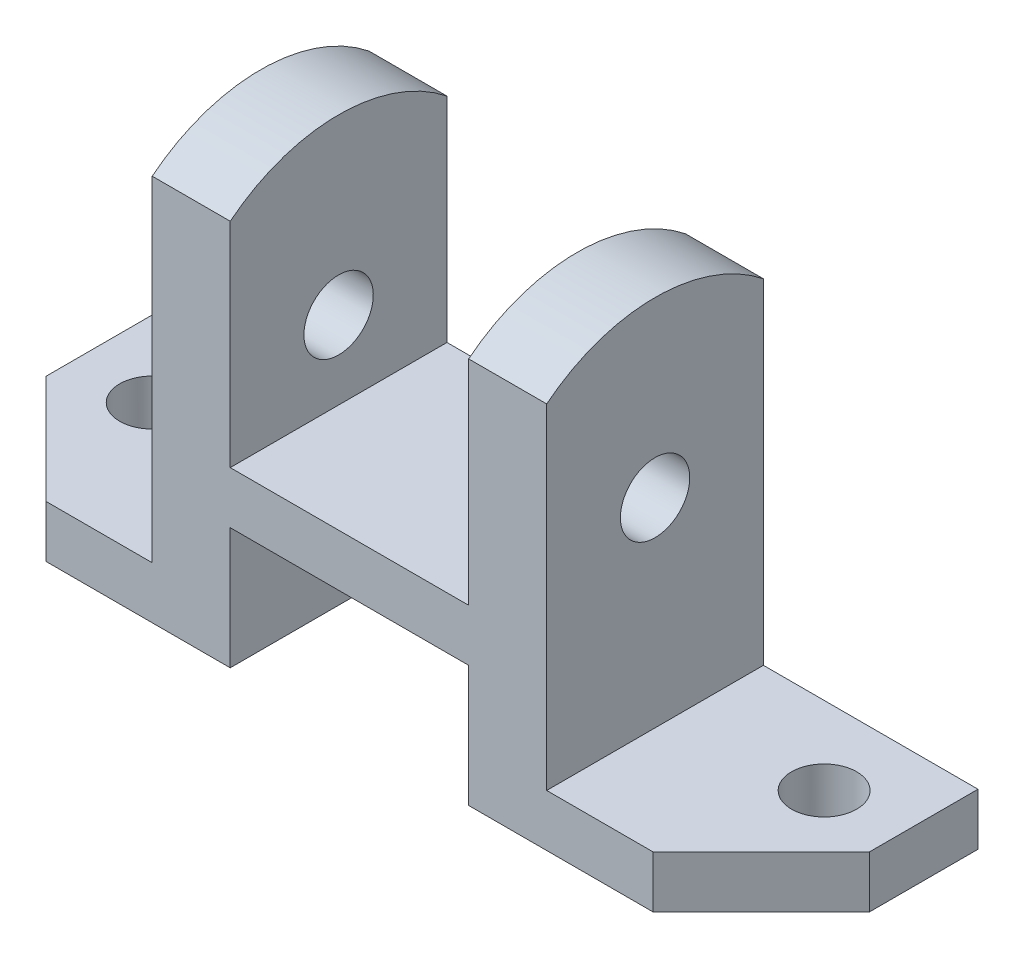
ISO-10303-21;
HEADER;
FILE_DESCRIPTION(('STEP AP214'),'2;1');
FILE_NAME('part.step','',(''),(''),'','','');
FILE_SCHEMA(('AUTOMOTIVE_DESIGN { 1 0 10303 214 1 1 1 1 }'));
ENDSEC;
DATA;
#1=APPLICATION_CONTEXT('core data for automotive mechanical design processes');
#2=APPLICATION_PROTOCOL_DEFINITION('international standard','automotive_design',2000,#1);
#3=PRODUCT_CONTEXT('',#1,'mechanical');
#4=PRODUCT('Part','Part','',(#3));
#5=PRODUCT_RELATED_PRODUCT_CATEGORY('part','',(#4));
#6=PRODUCT_DEFINITION_FORMATION('','',#4);
#7=PRODUCT_DEFINITION_CONTEXT('part definition',#1,'design');
#8=PRODUCT_DEFINITION('design','',#6,#7);
#9=PRODUCT_DEFINITION_SHAPE('','',#8);
#10=(LENGTH_UNIT() NAMED_UNIT(*) SI_UNIT(.MILLI.,.METRE.));
#11=(NAMED_UNIT(*) PLANE_ANGLE_UNIT() SI_UNIT($,.RADIAN.));
#12=(NAMED_UNIT(*) SI_UNIT($,.STERADIAN.) SOLID_ANGLE_UNIT());
#13=UNCERTAINTY_MEASURE_WITH_UNIT(LENGTH_MEASURE(1.E-05),#10,'distance_accuracy_value','');
#14=(GEOMETRIC_REPRESENTATION_CONTEXT(3) GLOBAL_UNCERTAINTY_ASSIGNED_CONTEXT((#13)) GLOBAL_UNIT_ASSIGNED_CONTEXT((#10,
#11,#12)) REPRESENTATION_CONTEXT('',''));
#15=CARTESIAN_POINT('',(0.,0.,0.));
#16=DIRECTION('',(0.,0.,1.));
#17=DIRECTION('',(1.,0.,0.));
#18=AXIS2_PLACEMENT_3D('',#15,#16,#17);
#19=CARTESIAN_POINT('',(0.,-40.,25.));
#20=DIRECTION('',(0.,-1.,0.));
#21=DIRECTION('',(0.,0.,-1.));
#22=AXIS2_PLACEMENT_3D('',#19,#20,#21);
#23=PLANE('',#22);
#24=DIRECTION('',(-1.,0.,0.));
#25=VECTOR('',#24,1.);
#26=CARTESIAN_POINT('',(0.,-40.,25.));
#27=LINE('',#26,#25);
#28=CARTESIAN_POINT('',(-27.5,-40.,25.));
#29=VERTEX_POINT('',#28);
#30=CARTESIAN_POINT('',(-70.,-40.,25.));
#31=VERTEX_POINT('',#30);
#32=EDGE_CURVE('E367',#29,#31,#27,.T.);
#33=ORIENTED_EDGE('',*,*,#32,.T.);
#34=DIRECTION('',(-0.707106781186547,0.,-0.707106781186548));
#35=VECTOR('',#34,1.);
#36=CARTESIAN_POINT('',(-35.0000000000001,-40.,60.));
#37=LINE('',#36,#35);
#38=CARTESIAN_POINT('',(-95.,-40.,0.));
#39=VERTEX_POINT('',#38);
#40=EDGE_CURVE('E307',#31,#39,#37,.T.);
#41=ORIENTED_EDGE('',*,*,#40,.T.);
#42=DIRECTION('',(0.,0.,-1.));
#43=VECTOR('',#42,1.);
#44=CARTESIAN_POINT('',(-95.,-40.,25.));
#45=LINE('',#44,#43);
#46=CARTESIAN_POINT('',(-95.,-40.,-25.));
#47=VERTEX_POINT('',#46);
#48=EDGE_CURVE('E285',#39,#47,#45,.T.);
#49=ORIENTED_EDGE('',*,*,#48,.T.);
#50=DIRECTION('',(-1.,0.,0.));
#51=VECTOR('',#50,1.);
#52=CARTESIAN_POINT('',(0.,-40.,-25.));
#53=LINE('',#52,#51);
#54=CARTESIAN_POINT('',(-27.5,-40.,-25.));
#55=VERTEX_POINT('',#54);
#56=EDGE_CURVE('E228',#55,#47,#53,.T.);
#57=ORIENTED_EDGE('',*,*,#56,.F.);
#58=DIRECTION('',(0.,0.,-1.));
#59=VECTOR('',#58,1.);
#60=CARTESIAN_POINT('',(-27.5,-40.,25.));
#61=LINE('',#60,#59);
#62=CARTESIAN_POINT('',(-27.5,-40.,-11.));
#63=VERTEX_POINT('',#62);
#64=EDGE_CURVE('E276',#63,#55,#61,.T.);
#65=ORIENTED_EDGE('',*,*,#64,.F.);
#66=DIRECTION('',(-1.,0.,0.));
#67=VECTOR('',#66,1.);
#68=CARTESIAN_POINT('',(27.5,-40.,-11.));
#69=LINE('',#68,#67);
#70=CARTESIAN_POINT('',(27.5,-40.,-11.));
#71=VERTEX_POINT('',#70);
#72=EDGE_CURVE('E359',#71,#63,#69,.T.);
#73=ORIENTED_EDGE('',*,*,#72,.F.);
#74=DIRECTION('',(0.,0.,-1.));
#75=VECTOR('',#74,1.);
#76=CARTESIAN_POINT('',(27.5,-40.,25.));
#77=LINE('',#76,#75);
#78=CARTESIAN_POINT('',(27.5,-40.,-25.));
#79=VERTEX_POINT('',#78);
#80=EDGE_CURVE('E270',#71,#79,#77,.T.);
#81=ORIENTED_EDGE('',*,*,#80,.T.);
#82=DIRECTION('',(-1.,0.,0.));
#83=VECTOR('',#82,1.);
#84=CARTESIAN_POINT('',(0.,-40.,-25.));
#85=LINE('',#84,#83);
#86=CARTESIAN_POINT('',(95.,-40.,-25.));
#87=VERTEX_POINT('',#86);
#88=EDGE_CURVE('E244',#87,#79,#85,.T.);
#89=ORIENTED_EDGE('',*,*,#88,.F.);
#90=DIRECTION('',(0.,0.,-1.));
#91=VECTOR('',#90,1.);
#92=CARTESIAN_POINT('',(95.,-40.,25.));
#93=LINE('',#92,#91);
#94=CARTESIAN_POINT('',(95.,-40.,0.));
#95=VERTEX_POINT('',#94);
#96=EDGE_CURVE('E264',#95,#87,#93,.T.);
#97=ORIENTED_EDGE('',*,*,#96,.F.);
#98=DIRECTION('',(0.707106781186549,0.,-0.707106781186546));
#99=VECTOR('',#98,1.);
#100=CARTESIAN_POINT('',(34.9999999999999,-40.,60.));
#101=LINE('',#100,#99);
#102=CARTESIAN_POINT('',(70.,-40.,25.));
#103=VERTEX_POINT('',#102);
#104=EDGE_CURVE('E305',#95,#103,#101,.F.);
#105=ORIENTED_EDGE('',*,*,#104,.T.);
#106=DIRECTION('',(-1.,0.,0.));
#107=VECTOR('',#106,1.);
#108=CARTESIAN_POINT('',(0.,-40.,25.));
#109=LINE('',#108,#107);
#110=CARTESIAN_POINT('',(27.5,-40.,25.));
#111=VERTEX_POINT('',#110);
#112=EDGE_CURVE('E336',#103,#111,#109,.T.);
#113=ORIENTED_EDGE('',*,*,#112,.T.);
#114=CARTESIAN_POINT('',(27.5,-40.,-3.));
#115=VERTEX_POINT('',#114);
#116=EDGE_CURVE('E268',#111,#115,#77,.T.);
#117=ORIENTED_EDGE('',*,*,#116,.T.);
#118=DIRECTION('',(-1.,0.,0.));
#119=VECTOR('',#118,1.);
#120=CARTESIAN_POINT('',(27.5,-40.,-3.));
#121=LINE('',#120,#119);
#122=CARTESIAN_POINT('',(-27.5,-40.,-3.));
#123=VERTEX_POINT('',#122);
#124=EDGE_CURVE('E399',#115,#123,#121,.T.);
#125=ORIENTED_EDGE('',*,*,#124,.T.);
#126=EDGE_CURVE('E278',#29,#123,#61,.T.);
#127=ORIENTED_EDGE('',*,*,#126,.F.);
#128=EDGE_LOOP('',(#33,#41,#49,#57,#65,#73,#81,#89,#97,#105,#113,#117,#125,#127));
#129=FACE_BOUND('',#128,.T.);
#130=CARTESIAN_POINT('',(77.5,-40.,-7.));
#131=DIRECTION('',(0.,-1.,0.));
#132=DIRECTION('',(0.,0.,-1.));
#133=AXIS2_PLACEMENT_3D('',#130,#131,#132);
#134=CIRCLE('',#133,7.50000000000001);
#135=CARTESIAN_POINT('',(77.5,-40.,-14.5));
#136=VERTEX_POINT('',#135);
#137=EDGE_CURVE('E488',#136,#136,#134,.T.);
#138=ORIENTED_EDGE('',*,*,#137,.F.);
#139=EDGE_LOOP('',(#138));
#140=FACE_BOUND('',#139,.T.);
#141=CARTESIAN_POINT('',(-77.5,-40.,-7.00000000000002));
#142=DIRECTION('',(0.,-1.,0.));
#143=DIRECTION('',(0.,0.,-1.));
#144=AXIS2_PLACEMENT_3D('',#141,#142,#143);
#145=CIRCLE('',#144,7.50000000000001);
#146=CARTESIAN_POINT('',(-77.5,-40.,-14.5));
#147=VERTEX_POINT('',#146);
#148=EDGE_CURVE('E296',#147,#147,#145,.F.);
#149=ORIENTED_EDGE('',*,*,#148,.T.);
#150=EDGE_LOOP('',(#149));
#151=FACE_BOUND('',#150,.T.);
#152=ADVANCED_FACE('F41',(#129,#140,#151),#23,.T.);
#153=CARTESIAN_POINT('',(-27.5,0.,25.));
#154=DIRECTION('',(-1.,0.,0.));
#155=DIRECTION('',(0.,0.,1.));
#156=AXIS2_PLACEMENT_3D('',#153,#154,#155);
#157=PLANE('',#156);
#158=CARTESIAN_POINT('',(-27.5,18.,0.));
#159=DIRECTION('',(-1.,0.,0.));
#160=DIRECTION('',(0.,0.,1.));
#161=AXIS2_PLACEMENT_3D('',#158,#159,#160);
#162=CIRCLE('',#161,8.);
#163=CARTESIAN_POINT('',(-27.5,18.,8.));
#164=VERTEX_POINT('',#163);
#165=EDGE_CURVE('E396',#164,#164,#162,.T.);
#166=ORIENTED_EDGE('',*,*,#165,.T.);
#167=EDGE_LOOP('',(#166));
#168=FACE_BOUND('',#167,.T.);
#169=DIRECTION('',(0.,1.,0.));
#170=VECTOR('',#169,1.);
#171=CARTESIAN_POINT('',(-27.5,0.,-25.));
#172=LINE('',#171,#170);
#173=CARTESIAN_POINT('',(-27.5,0.,-25.));
#174=VERTEX_POINT('',#173);
#175=CARTESIAN_POINT('',(-27.5,49.224989991992,-25.));
#176=VERTEX_POINT('',#175);
#177=EDGE_CURVE('E219',#174,#176,#172,.T.);
#178=ORIENTED_EDGE('',*,*,#177,.T.);
#179=CARTESIAN_POINT('',(-27.5,18.,0.));
#180=DIRECTION('',(-1.,0.,0.));
#181=DIRECTION('',(0.,0.,1.));
#182=AXIS2_PLACEMENT_3D('',#179,#180,#181);
#183=CIRCLE('',#182,40.);
#184=CARTESIAN_POINT('',(-27.5,49.224989991992,25.));
#185=VERTEX_POINT('',#184);
#186=EDGE_CURVE('E210',#185,#176,#183,.T.);
#187=ORIENTED_EDGE('',*,*,#186,.F.);
#188=DIRECTION('',(0.,1.,0.));
#189=VECTOR('',#188,1.);
#190=CARTESIAN_POINT('',(-27.5,0.,25.));
#191=LINE('',#190,#189);
#192=CARTESIAN_POINT('',(-27.5,0.,25.));
#193=VERTEX_POINT('',#192);
#194=EDGE_CURVE('E365',#193,#185,#191,.T.);
#195=ORIENTED_EDGE('',*,*,#194,.F.);
#196=DIRECTION('',(0.,0.,-1.));
#197=VECTOR('',#196,1.);
#198=CARTESIAN_POINT('',(-27.5,0.,25.));
#199=LINE('',#198,#197);
#200=EDGE_CURVE('E288',#193,#174,#199,.T.);
#201=ORIENTED_EDGE('',*,*,#200,.T.);
#202=EDGE_LOOP('',(#178,#187,#195,#201));
#203=FACE_BOUND('',#202,.T.);
#204=ADVANCED_FACE('F432',(#168,#203),#157,.F.);
#205=CARTESIAN_POINT('',(45.5,0.,25.));
#206=DIRECTION('',(1.,0.,0.));
#207=DIRECTION('',(0.,1.,0.));
#208=AXIS2_PLACEMENT_3D('',#205,#206,#207);
#209=PLANE('',#208);
#210=CARTESIAN_POINT('',(45.5,18.,0.));
#211=DIRECTION('',(1.,0.,0.));
#212=DIRECTION('',(0.,1.,0.));
#213=AXIS2_PLACEMENT_3D('',#210,#211,#212);
#214=CIRCLE('',#213,8.);
#215=CARTESIAN_POINT('',(45.5,26.,0.));
#216=VERTEX_POINT('',#215);
#217=EDGE_CURVE('E293',#216,#216,#214,.T.);
#218=ORIENTED_EDGE('',*,*,#217,.F.);
#219=EDGE_LOOP('',(#218));
#220=FACE_BOUND('',#219,.T.);
#221=DIRECTION('',(0.,-1.,0.));
#222=VECTOR('',#221,1.);
#223=CARTESIAN_POINT('',(45.5,0.,-25.));
#224=LINE('',#223,#222);
#225=CARTESIAN_POINT('',(45.5,49.224989991992,-25.));
#226=VERTEX_POINT('',#225);
#227=CARTESIAN_POINT('',(45.5,-28.,-25.));
#228=VERTEX_POINT('',#227);
#229=EDGE_CURVE('E253',#226,#228,#224,.T.);
#230=ORIENTED_EDGE('',*,*,#229,.F.);
#231=CARTESIAN_POINT('',(45.5,18.,0.));
#232=DIRECTION('',(1.,0.,0.));
#233=DIRECTION('',(0.,1.,0.));
#234=AXIS2_PLACEMENT_3D('',#231,#232,#233);
#235=CIRCLE('',#234,40.);
#236=CARTESIAN_POINT('',(45.5,49.224989991992,25.));
#237=VERTEX_POINT('',#236);
#238=EDGE_CURVE('E500',#226,#237,#235,.T.);
#239=ORIENTED_EDGE('',*,*,#238,.T.);
#240=DIRECTION('',(0.,-1.,0.));
#241=VECTOR('',#240,1.);
#242=CARTESIAN_POINT('',(45.5,0.,25.));
#243=LINE('',#242,#241);
#244=CARTESIAN_POINT('',(45.5,-28.,25.));
#245=VERTEX_POINT('',#244);
#246=EDGE_CURVE('E339',#237,#245,#243,.T.);
#247=ORIENTED_EDGE('',*,*,#246,.T.);
#248=DIRECTION('',(0.,0.,-1.));
#249=VECTOR('',#248,1.);
#250=CARTESIAN_POINT('',(45.5,-28.,25.));
#251=LINE('',#250,#249);
#252=EDGE_CURVE('E259',#245,#228,#251,.T.);
#253=ORIENTED_EDGE('',*,*,#252,.T.);
#254=EDGE_LOOP('',(#230,#239,#247,#253));
#255=FACE_BOUND('',#254,.T.);
#256=ADVANCED_FACE('F439',(#220,#255),#209,.T.);
#257=CARTESIAN_POINT('',(27.5,0.,25.));
#258=DIRECTION('',(-1.,0.,0.));
#259=DIRECTION('',(0.,0.,1.));
#260=AXIS2_PLACEMENT_3D('',#257,#258,#259);
#261=PLANE('',#260);
#262=CARTESIAN_POINT('',(27.5,18.,0.));
#263=DIRECTION('',(-1.,0.,0.));
#264=DIRECTION('',(0.,0.,1.));
#265=AXIS2_PLACEMENT_3D('',#262,#263,#264);
#266=CIRCLE('',#265,8.);
#267=CARTESIAN_POINT('',(27.5,18.,8.));
#268=VERTEX_POINT('',#267);
#269=EDGE_CURVE('E295',#268,#268,#266,.T.);
#270=ORIENTED_EDGE('',*,*,#269,.F.);
#271=EDGE_LOOP('',(#270));
#272=FACE_BOUND('',#271,.T.);
#273=CARTESIAN_POINT('',(27.5,18.,0.));
#274=DIRECTION('',(-1.,0.,0.));
#275=DIRECTION('',(0.,0.,1.));
#276=AXIS2_PLACEMENT_3D('',#273,#274,#275);
#277=CIRCLE('',#276,40.);
#278=CARTESIAN_POINT('',(27.5,49.224989991992,25.));
#279=VERTEX_POINT('',#278);
#280=CARTESIAN_POINT('',(27.5,49.224989991992,-25.));
#281=VERTEX_POINT('',#280);
#282=EDGE_CURVE('E492',#279,#281,#277,.T.);
#283=ORIENTED_EDGE('',*,*,#282,.T.);
#284=DIRECTION('',(0.,1.,0.));
#285=VECTOR('',#284,1.);
#286=CARTESIAN_POINT('',(27.5,0.,-25.));
#287=LINE('',#286,#285);
#288=CARTESIAN_POINT('',(27.5,0.,-25.));
#289=VERTEX_POINT('',#288);
#290=EDGE_CURVE('E251',#289,#281,#287,.T.);
#291=ORIENTED_EDGE('',*,*,#290,.F.);
#292=DIRECTION('',(0.,0.,-1.));
#293=VECTOR('',#292,1.);
#294=CARTESIAN_POINT('',(27.5,0.,25.));
#295=LINE('',#294,#293);
#296=CARTESIAN_POINT('',(27.5,0.,25.));
#297=VERTEX_POINT('',#296);
#298=EDGE_CURVE('E260',#297,#289,#295,.T.);
#299=ORIENTED_EDGE('',*,*,#298,.F.);
#300=DIRECTION('',(0.,1.,0.));
#301=VECTOR('',#300,1.);
#302=CARTESIAN_POINT('',(27.5,0.,25.));
#303=LINE('',#302,#301);
#304=EDGE_CURVE('E257',#297,#279,#303,.T.);
#305=ORIENTED_EDGE('',*,*,#304,.T.);
#306=EDGE_LOOP('',(#283,#291,#299,#305));
#307=FACE_BOUND('',#306,.T.);
#308=ADVANCED_FACE('F446',(#272,#307),#261,.T.);
#309=CARTESIAN_POINT('',(0.,0.,-25.));
#310=DIRECTION('',(0.,0.,1.));
#311=DIRECTION('',(1.,0.,0.));
#312=AXIS2_PLACEMENT_3D('',#309,#310,#311);
#313=PLANE('',#312);
#314=DIRECTION('',(-1.,0.,0.));
#315=VECTOR('',#314,1.);
#316=CARTESIAN_POINT('',(54.5,49.224989991992,-25.));
#317=LINE('',#316,#315);
#318=EDGE_CURVE('E211',#226,#281,#317,.T.);
#319=ORIENTED_EDGE('',*,*,#318,.F.);
#320=ORIENTED_EDGE('',*,*,#229,.T.);
#321=DIRECTION('',(1.,0.,0.));
#322=VECTOR('',#321,1.);
#323=CARTESIAN_POINT('',(0.,-28.,-25.));
#324=LINE('',#323,#322);
#325=CARTESIAN_POINT('',(95.,-28.,-25.));
#326=VERTEX_POINT('',#325);
#327=EDGE_CURVE('E249',#228,#326,#324,.T.);
#328=ORIENTED_EDGE('',*,*,#327,.T.);
#329=DIRECTION('',(0.,-1.,0.));
#330=VECTOR('',#329,1.);
#331=CARTESIAN_POINT('',(95.,1.09865820145198E-13,-25.));
#332=LINE('',#331,#330);
#333=EDGE_CURVE('E243',#326,#87,#332,.T.);
#334=ORIENTED_EDGE('',*,*,#333,.T.);
#335=ORIENTED_EDGE('',*,*,#88,.T.);
#336=DIRECTION('',(0.,1.,0.));
#337=VECTOR('',#336,1.);
#338=CARTESIAN_POINT('',(27.5,0.,-25.));
#339=LINE('',#338,#337);
#340=CARTESIAN_POINT('',(27.5,-12.,-25.));
#341=VERTEX_POINT('',#340);
#342=EDGE_CURVE('E239',#79,#341,#339,.T.);
#343=ORIENTED_EDGE('',*,*,#342,.T.);
#344=DIRECTION('',(-1.,0.,0.));
#345=VECTOR('',#344,1.);
#346=CARTESIAN_POINT('',(0.,-12.,-25.));
#347=LINE('',#346,#345);
#348=CARTESIAN_POINT('',(-27.5,-12.,-25.));
#349=VERTEX_POINT('',#348);
#350=EDGE_CURVE('E237',#341,#349,#347,.T.);
#351=ORIENTED_EDGE('',*,*,#350,.T.);
#352=DIRECTION('',(0.,1.,0.));
#353=VECTOR('',#352,1.);
#354=CARTESIAN_POINT('',(-27.5,0.,-25.));
#355=LINE('',#354,#353);
#356=EDGE_CURVE('E234',#55,#349,#355,.T.);
#357=ORIENTED_EDGE('',*,*,#356,.F.);
#358=ORIENTED_EDGE('',*,*,#56,.T.);
#359=DIRECTION('',(0.,-1.,0.));
#360=VECTOR('',#359,1.);
#361=CARTESIAN_POINT('',(-95.,1.09865820145198E-13,-25.));
#362=LINE('',#361,#360);
#363=CARTESIAN_POINT('',(-95.,-28.,-25.));
#364=VERTEX_POINT('',#363);
#365=EDGE_CURVE('E225',#364,#47,#362,.T.);
#366=ORIENTED_EDGE('',*,*,#365,.F.);
#367=DIRECTION('',(-1.,0.,0.));
#368=VECTOR('',#367,1.);
#369=CARTESIAN_POINT('',(0.,-28.,-25.));
#370=LINE('',#369,#368);
#371=CARTESIAN_POINT('',(-45.5,-28.,-25.));
#372=VERTEX_POINT('',#371);
#373=EDGE_CURVE('E218',#372,#364,#370,.T.);
#374=ORIENTED_EDGE('',*,*,#373,.F.);
#375=DIRECTION('',(0.,-1.,0.));
#376=VECTOR('',#375,1.);
#377=CARTESIAN_POINT('',(-45.5,0.,-25.));
#378=LINE('',#377,#376);
#379=CARTESIAN_POINT('',(-45.5,49.224989991992,-25.));
#380=VERTEX_POINT('',#379);
#381=EDGE_CURVE('E195',#380,#372,#378,.T.);
#382=ORIENTED_EDGE('',*,*,#381,.F.);
#383=EDGE_CURVE('E204',#176,#380,#317,.T.);
#384=ORIENTED_EDGE('',*,*,#383,.F.);
#385=ORIENTED_EDGE('',*,*,#177,.F.);
#386=DIRECTION('',(1.,0.,0.));
#387=VECTOR('',#386,1.);
#388=CARTESIAN_POINT('',(0.,0.,-25.));
#389=LINE('',#388,#387);
#390=EDGE_CURVE('E221',#174,#289,#389,.T.);
#391=ORIENTED_EDGE('',*,*,#390,.T.);
#392=ORIENTED_EDGE('',*,*,#290,.T.);
#393=EDGE_LOOP('',(#319,#320,#328,#334,#335,#343,#351,#357,#358,#366,#374,#382,#384,#385,#391,#392));
#394=FACE_BOUND('',#393,.T.);
#395=ADVANCED_FACE('F216',(#394),#313,.F.);
#396=CARTESIAN_POINT('',(0.,0.,25.));
#397=DIRECTION('',(0.,0.,1.));
#398=DIRECTION('',(1.,0.,0.));
#399=AXIS2_PLACEMENT_3D('',#396,#397,#398);
#400=PLANE('',#399);
#401=DIRECTION('',(-1.,0.,0.));
#402=VECTOR('',#401,1.);
#403=CARTESIAN_POINT('',(0.,-28.,25.));
#404=LINE('',#403,#402);
#405=CARTESIAN_POINT('',(-45.5,-28.,25.));
#406=VERTEX_POINT('',#405);
#407=CARTESIAN_POINT('',(-70.,-28.,25.));
#408=VERTEX_POINT('',#407);
#409=EDGE_CURVE('E366',#406,#408,#404,.T.);
#410=ORIENTED_EDGE('',*,*,#409,.T.);
#411=DIRECTION('',(0.,-1.,0.));
#412=VECTOR('',#411,1.);
#413=CARTESIAN_POINT('',(-70.,-40.,25.));
#414=LINE('',#413,#412);
#415=EDGE_CURVE('E302',#408,#31,#414,.T.);
#416=ORIENTED_EDGE('',*,*,#415,.T.);
#417=ORIENTED_EDGE('',*,*,#32,.F.);
#418=DIRECTION('',(0.,1.,0.));
#419=VECTOR('',#418,1.);
#420=CARTESIAN_POINT('',(-27.5,0.,25.));
#421=LINE('',#420,#419);
#422=CARTESIAN_POINT('',(-27.5,-12.,25.));
#423=VERTEX_POINT('',#422);
#424=EDGE_CURVE('E375',#29,#423,#421,.T.);
#425=ORIENTED_EDGE('',*,*,#424,.T.);
#426=DIRECTION('',(-1.,0.,0.));
#427=VECTOR('',#426,1.);
#428=CARTESIAN_POINT('',(0.,-12.,25.));
#429=LINE('',#428,#427);
#430=CARTESIAN_POINT('',(27.5,-12.,25.));
#431=VERTEX_POINT('',#430);
#432=EDGE_CURVE('E372',#431,#423,#429,.T.);
#433=ORIENTED_EDGE('',*,*,#432,.F.);
#434=DIRECTION('',(0.,1.,0.));
#435=VECTOR('',#434,1.);
#436=CARTESIAN_POINT('',(27.5,0.,25.));
#437=LINE('',#436,#435);
#438=EDGE_CURVE('E342',#111,#431,#437,.T.);
#439=ORIENTED_EDGE('',*,*,#438,.F.);
#440=ORIENTED_EDGE('',*,*,#112,.F.);
#441=DIRECTION('',(0.,1.,0.));
#442=VECTOR('',#441,1.);
#443=CARTESIAN_POINT('',(69.9999999999999,0.,25.));
#444=LINE('',#443,#442);
#445=CARTESIAN_POINT('',(70.,-28.,25.));
#446=VERTEX_POINT('',#445);
#447=EDGE_CURVE('E298',#103,#446,#444,.T.);
#448=ORIENTED_EDGE('',*,*,#447,.T.);
#449=DIRECTION('',(1.,0.,0.));
#450=VECTOR('',#449,1.);
#451=CARTESIAN_POINT('',(0.,-28.,25.));
#452=LINE('',#451,#450);
#453=EDGE_CURVE('E329',#245,#446,#452,.T.);
#454=ORIENTED_EDGE('',*,*,#453,.F.);
#455=ORIENTED_EDGE('',*,*,#246,.F.);
#456=DIRECTION('',(-1.,0.,0.));
#457=VECTOR('',#456,1.);
#458=CARTESIAN_POINT('',(54.5,49.224989991992,25.));
#459=LINE('',#458,#457);
#460=EDGE_CURVE('E215',#237,#279,#459,.T.);
#461=ORIENTED_EDGE('',*,*,#460,.T.);
#462=ORIENTED_EDGE('',*,*,#304,.F.);
#463=DIRECTION('',(1.,0.,0.));
#464=VECTOR('',#463,1.);
#465=CARTESIAN_POINT('',(0.,0.,25.));
#466=LINE('',#465,#464);
#467=EDGE_CURVE('E258',#193,#297,#466,.T.);
#468=ORIENTED_EDGE('',*,*,#467,.F.);
#469=ORIENTED_EDGE('',*,*,#194,.T.);
#470=CARTESIAN_POINT('',(-45.5,49.224989991992,25.));
#471=VERTEX_POINT('',#470);
#472=EDGE_CURVE('E292',#185,#471,#459,.T.);
#473=ORIENTED_EDGE('',*,*,#472,.T.);
#474=DIRECTION('',(0.,-1.,0.));
#475=VECTOR('',#474,1.);
#476=CARTESIAN_POINT('',(-45.5,0.,25.));
#477=LINE('',#476,#475);
#478=EDGE_CURVE('E197',#471,#406,#477,.T.);
#479=ORIENTED_EDGE('',*,*,#478,.T.);
#480=EDGE_LOOP('',(#410,#416,#417,#425,#433,#439,#440,#448,#454,#455,#461,#462,#468,#469,#473,#479));
#481=FACE_BOUND('',#480,.T.);
#482=ADVANCED_FACE('F333',(#481),#400,.T.);
#483=CARTESIAN_POINT('',(-27.5,0.,25.));
#484=DIRECTION('',(-1.,0.,0.));
#485=DIRECTION('',(0.,0.,1.));
#486=AXIS2_PLACEMENT_3D('',#483,#484,#485);
#487=PLANE('',#486);
#488=DIRECTION('',(0.,1.,0.));
#489=VECTOR('',#488,1.);
#490=CARTESIAN_POINT('',(-27.5,-40.,-3.));
#491=LINE('',#490,#489);
#492=CARTESIAN_POINT('',(-27.5,-12.,-3.));
#493=VERTEX_POINT('',#492);
#494=EDGE_CURVE('E392',#123,#493,#491,.T.);
#495=ORIENTED_EDGE('',*,*,#494,.T.);
#496=DIRECTION('',(0.,0.,-1.));
#497=VECTOR('',#496,1.);
#498=CARTESIAN_POINT('',(-27.5,-12.,25.));
#499=LINE('',#498,#497);
#500=EDGE_CURVE('E277',#423,#493,#499,.T.);
#501=ORIENTED_EDGE('',*,*,#500,.F.);
#502=ORIENTED_EDGE('',*,*,#424,.F.);
#503=ORIENTED_EDGE('',*,*,#126,.T.);
#504=EDGE_LOOP('',(#495,#501,#502,#503));
#505=FACE_BOUND('',#504,.T.);
#506=ADVANCED_FACE('F393',(#505),#487,.F.);
#507=CARTESIAN_POINT('',(0.,-12.,25.));
#508=DIRECTION('',(0.,-1.,0.));
#509=DIRECTION('',(0.,0.,-1.));
#510=AXIS2_PLACEMENT_3D('',#507,#508,#509);
#511=PLANE('',#510);
#512=ORIENTED_EDGE('',*,*,#500,.T.);
#513=DIRECTION('',(1.,0.,0.));
#514=VECTOR('',#513,1.);
#515=CARTESIAN_POINT('',(0.,-12.,-3.));
#516=LINE('',#515,#514);
#517=CARTESIAN_POINT('',(27.5,-12.,-3.));
#518=VERTEX_POINT('',#517);
#519=EDGE_CURVE('E352',#493,#518,#516,.T.);
#520=ORIENTED_EDGE('',*,*,#519,.T.);
#521=DIRECTION('',(0.,0.,-1.));
#522=VECTOR('',#521,1.);
#523=CARTESIAN_POINT('',(27.5,-12.,25.));
#524=LINE('',#523,#522);
#525=EDGE_CURVE('E275',#431,#518,#524,.T.);
#526=ORIENTED_EDGE('',*,*,#525,.F.);
#527=ORIENTED_EDGE('',*,*,#432,.T.);
#528=EDGE_LOOP('',(#512,#520,#526,#527));
#529=FACE_BOUND('',#528,.T.);
#530=ADVANCED_FACE('F390',(#529),#511,.T.);
#531=CARTESIAN_POINT('',(27.5,0.,25.));
#532=DIRECTION('',(-1.,0.,0.));
#533=DIRECTION('',(0.,0.,1.));
#534=AXIS2_PLACEMENT_3D('',#531,#532,#533);
#535=PLANE('',#534);
#536=ORIENTED_EDGE('',*,*,#525,.T.);
#537=DIRECTION('',(0.,1.,0.));
#538=VECTOR('',#537,1.);
#539=CARTESIAN_POINT('',(27.5,-40.,-3.));
#540=LINE('',#539,#538);
#541=EDGE_CURVE('E395',#115,#518,#540,.T.);
#542=ORIENTED_EDGE('',*,*,#541,.F.);
#543=ORIENTED_EDGE('',*,*,#116,.F.);
#544=ORIENTED_EDGE('',*,*,#438,.T.);
#545=EDGE_LOOP('',(#536,#542,#543,#544));
#546=FACE_BOUND('',#545,.T.);
#547=ADVANCED_FACE('F379',(#546),#535,.T.);
#548=CARTESIAN_POINT('',(0.,0.,25.));
#549=DIRECTION('',(0.,1.,0.));
#550=DIRECTION('',(0.,0.,1.));
#551=AXIS2_PLACEMENT_3D('',#548,#549,#550);
#552=PLANE('',#551);
#553=ORIENTED_EDGE('',*,*,#390,.F.);
#554=ORIENTED_EDGE('',*,*,#200,.F.);
#555=ORIENTED_EDGE('',*,*,#467,.T.);
#556=ORIENTED_EDGE('',*,*,#298,.T.);
#557=EDGE_LOOP('',(#553,#554,#555,#556));
#558=FACE_BOUND('',#557,.T.);
#559=ADVANCED_FACE('F435',(#558),#552,.T.);
#560=CARTESIAN_POINT('',(-45.5,0.,25.));
#561=DIRECTION('',(1.,0.,0.));
#562=DIRECTION('',(0.,1.,0.));
#563=AXIS2_PLACEMENT_3D('',#560,#561,#562);
#564=PLANE('',#563);
#565=CARTESIAN_POINT('',(-45.5,18.,0.));
#566=DIRECTION('',(-1.,0.,0.));
#567=DIRECTION('',(0.,-1.,0.));
#568=AXIS2_PLACEMENT_3D('',#565,#566,#567);
#569=CIRCLE('',#568,8.);
#570=CARTESIAN_POINT('',(-45.5,10.,0.));
#571=VERTEX_POINT('',#570);
#572=EDGE_CURVE('E199',#571,#571,#569,.T.);
#573=ORIENTED_EDGE('',*,*,#572,.F.);
#574=EDGE_LOOP('',(#573));
#575=FACE_BOUND('',#574,.T.);
#576=CARTESIAN_POINT('',(-45.5,18.,0.));
#577=DIRECTION('',(-1.,0.,0.));
#578=DIRECTION('',(0.,-1.,0.));
#579=AXIS2_PLACEMENT_3D('',#576,#577,#578);
#580=CIRCLE('',#579,40.);
#581=EDGE_CURVE('E188',#471,#380,#580,.T.);
#582=ORIENTED_EDGE('',*,*,#581,.T.);
#583=ORIENTED_EDGE('',*,*,#381,.T.);
#584=DIRECTION('',(0.,0.,-1.));
#585=VECTOR('',#584,1.);
#586=CARTESIAN_POINT('',(-45.5,-28.,25.));
#587=LINE('',#586,#585);
#588=EDGE_CURVE('E287',#406,#372,#587,.T.);
#589=ORIENTED_EDGE('',*,*,#588,.F.);
#590=ORIENTED_EDGE('',*,*,#478,.F.);
#591=EDGE_LOOP('',(#582,#583,#589,#590));
#592=FACE_BOUND('',#591,.T.);
#593=ADVANCED_FACE('F192',(#575,#592),#564,.F.);
#594=CARTESIAN_POINT('',(0.,-28.,25.));
#595=DIRECTION('',(0.,-1.,0.));
#596=DIRECTION('',(1.,0.,0.));
#597=AXIS2_PLACEMENT_3D('',#594,#595,#596);
#598=PLANE('',#597);
#599=CARTESIAN_POINT('',(-77.5,-28.,-7.00000000000002));
#600=DIRECTION('',(0.,-1.,0.));
#601=DIRECTION('',(1.,0.,0.));
#602=AXIS2_PLACEMENT_3D('',#599,#600,#601);
#603=CIRCLE('',#602,7.50000000000001);
#604=CARTESIAN_POINT('',(-70.,-28.,-7.00000000000002));
#605=VERTEX_POINT('',#604);
#606=EDGE_CURVE('E203',#605,#605,#603,.F.);
#607=ORIENTED_EDGE('',*,*,#606,.F.);
#608=EDGE_LOOP('',(#607));
#609=FACE_BOUND('',#608,.T.);
#610=DIRECTION('',(0.,0.,-1.));
#611=VECTOR('',#610,1.);
#612=CARTESIAN_POINT('',(-95.,-28.,25.));
#613=LINE('',#612,#611);
#614=CARTESIAN_POINT('',(-95.,-28.,0.));
#615=VERTEX_POINT('',#614);
#616=EDGE_CURVE('E283',#615,#364,#613,.T.);
#617=ORIENTED_EDGE('',*,*,#616,.F.);
#618=DIRECTION('',(0.707106781186547,0.,0.707106781186548));
#619=VECTOR('',#618,1.);
#620=CARTESIAN_POINT('',(-70.,-28.,25.));
#621=LINE('',#620,#619);
#622=EDGE_CURVE('E309',#615,#408,#621,.T.);
#623=ORIENTED_EDGE('',*,*,#622,.T.);
#624=ORIENTED_EDGE('',*,*,#409,.F.);
#625=ORIENTED_EDGE('',*,*,#588,.T.);
#626=ORIENTED_EDGE('',*,*,#373,.T.);
#627=EDGE_LOOP('',(#617,#623,#624,#625,#626));
#628=FACE_BOUND('',#627,.T.);
#629=ADVANCED_FACE('F517',(#609,#628),#598,.F.);
#630=CARTESIAN_POINT('',(-95.,1.09865820145198E-13,25.));
#631=DIRECTION('',(1.,0.,0.));
#632=DIRECTION('',(0.,1.,0.));
#633=AXIS2_PLACEMENT_3D('',#630,#631,#632);
#634=PLANE('',#633);
#635=ORIENTED_EDGE('',*,*,#48,.F.);
#636=DIRECTION('',(0.,1.,0.));
#637=VECTOR('',#636,1.);
#638=CARTESIAN_POINT('',(-95.,-28.,0.));
#639=LINE('',#638,#637);
#640=EDGE_CURVE('E65',#39,#615,#639,.T.);
#641=ORIENTED_EDGE('',*,*,#640,.T.);
#642=ORIENTED_EDGE('',*,*,#616,.T.);
#643=ORIENTED_EDGE('',*,*,#365,.T.);
#644=EDGE_LOOP('',(#635,#641,#642,#643));
#645=FACE_BOUND('',#644,.T.);
#646=ADVANCED_FACE('F527',(#645),#634,.F.);
#647=CARTESIAN_POINT('',(-27.5,-12.,-11.));
#648=VERTEX_POINT('',#647);
#649=EDGE_CURVE('E274',#648,#349,#499,.T.);
#650=ORIENTED_EDGE('',*,*,#649,.F.);
#651=DIRECTION('',(0.,1.,0.));
#652=VECTOR('',#651,1.);
#653=CARTESIAN_POINT('',(-27.5,-40.,-11.));
#654=LINE('',#653,#652);
#655=EDGE_CURVE('E401',#63,#648,#654,.T.);
#656=ORIENTED_EDGE('',*,*,#655,.F.);
#657=ORIENTED_EDGE('',*,*,#64,.T.);
#658=ORIENTED_EDGE('',*,*,#356,.T.);
#659=EDGE_LOOP('',(#650,#656,#657,#658));
#660=FACE_BOUND('',#659,.T.);
#661=ADVANCED_FACE('F412',(#660),#487,.F.);
#662=DIRECTION('',(1.,0.,0.));
#663=VECTOR('',#662,1.);
#664=CARTESIAN_POINT('',(0.,-12.,-11.));
#665=LINE('',#664,#663);
#666=CARTESIAN_POINT('',(27.5,-12.,-11.));
#667=VERTEX_POINT('',#666);
#668=EDGE_CURVE('E346',#648,#667,#665,.T.);
#669=ORIENTED_EDGE('',*,*,#668,.F.);
#670=ORIENTED_EDGE('',*,*,#649,.T.);
#671=ORIENTED_EDGE('',*,*,#350,.F.);
#672=EDGE_CURVE('E271',#667,#341,#524,.T.);
#673=ORIENTED_EDGE('',*,*,#672,.F.);
#674=EDGE_LOOP('',(#669,#670,#671,#673));
#675=FACE_BOUND('',#674,.T.);
#676=ADVANCED_FACE('F416',(#675),#511,.T.);
#677=DIRECTION('',(0.,1.,0.));
#678=VECTOR('',#677,1.);
#679=CARTESIAN_POINT('',(27.5,-40.,-11.));
#680=LINE('',#679,#678);
#681=EDGE_CURVE('E404',#71,#667,#680,.T.);
#682=ORIENTED_EDGE('',*,*,#681,.T.);
#683=ORIENTED_EDGE('',*,*,#672,.T.);
#684=ORIENTED_EDGE('',*,*,#342,.F.);
#685=ORIENTED_EDGE('',*,*,#80,.F.);
#686=EDGE_LOOP('',(#682,#683,#684,#685));
#687=FACE_BOUND('',#686,.T.);
#688=ADVANCED_FACE('F419',(#687),#535,.T.);
#689=CARTESIAN_POINT('',(95.,1.09865820145198E-13,25.));
#690=DIRECTION('',(1.,0.,0.));
#691=DIRECTION('',(0.,1.,0.));
#692=AXIS2_PLACEMENT_3D('',#689,#690,#691);
#693=PLANE('',#692);
#694=DIRECTION('',(0.,0.,-1.));
#695=VECTOR('',#694,1.);
#696=CARTESIAN_POINT('',(95.,-28.,25.));
#697=LINE('',#696,#695);
#698=CARTESIAN_POINT('',(95.,-28.,0.));
#699=VERTEX_POINT('',#698);
#700=EDGE_CURVE('E263',#699,#326,#697,.T.);
#701=ORIENTED_EDGE('',*,*,#700,.F.);
#702=DIRECTION('',(0.,-1.,0.));
#703=VECTOR('',#702,1.);
#704=CARTESIAN_POINT('',(95.,1.09865820145198E-13,0.));
#705=LINE('',#704,#703);
#706=EDGE_CURVE('E49',#699,#95,#705,.T.);
#707=ORIENTED_EDGE('',*,*,#706,.T.);
#708=ORIENTED_EDGE('',*,*,#96,.T.);
#709=ORIENTED_EDGE('',*,*,#333,.F.);
#710=EDGE_LOOP('',(#701,#707,#708,#709));
#711=FACE_BOUND('',#710,.T.);
#712=ADVANCED_FACE('F312',(#711),#693,.T.);
#713=CARTESIAN_POINT('',(0.,-28.,25.));
#714=DIRECTION('',(0.,1.,0.));
#715=DIRECTION('',(-1.,0.,0.));
#716=AXIS2_PLACEMENT_3D('',#713,#714,#715);
#717=PLANE('',#716);
#718=CARTESIAN_POINT('',(77.5,-28.,-7.));
#719=DIRECTION('',(0.,1.,0.));
#720=DIRECTION('',(-1.,0.,0.));
#721=AXIS2_PLACEMENT_3D('',#718,#719,#720);
#722=CIRCLE('',#721,7.50000000000001);
#723=CARTESIAN_POINT('',(70.,-28.,-7.));
#724=VERTEX_POINT('',#723);
#725=EDGE_CURVE('E297',#724,#724,#722,.T.);
#726=ORIENTED_EDGE('',*,*,#725,.F.);
#727=EDGE_LOOP('',(#726));
#728=FACE_BOUND('',#727,.T.);
#729=ORIENTED_EDGE('',*,*,#453,.T.);
#730=DIRECTION('',(-0.707106781186549,0.,0.707106781186546));
#731=VECTOR('',#730,1.);
#732=CARTESIAN_POINT('',(34.9999999999999,-28.,60.));
#733=LINE('',#732,#731);
#734=EDGE_CURVE('E11',#446,#699,#733,.F.);
#735=ORIENTED_EDGE('',*,*,#734,.T.);
#736=ORIENTED_EDGE('',*,*,#700,.T.);
#737=ORIENTED_EDGE('',*,*,#327,.F.);
#738=ORIENTED_EDGE('',*,*,#252,.F.);
#739=EDGE_LOOP('',(#729,#735,#736,#737,#738));
#740=FACE_BOUND('',#739,.T.);
#741=ADVANCED_FACE('F327',(#728,#740),#717,.T.);
#742=CARTESIAN_POINT('',(27.5,-40.,-11.));
#743=DIRECTION('',(0.,0.,-1.));
#744=DIRECTION('',(-1.,0.,0.));
#745=AXIS2_PLACEMENT_3D('',#742,#743,#744);
#746=PLANE('',#745);
#747=ORIENTED_EDGE('',*,*,#655,.T.);
#748=ORIENTED_EDGE('',*,*,#668,.T.);
#749=ORIENTED_EDGE('',*,*,#681,.F.);
#750=ORIENTED_EDGE('',*,*,#72,.T.);
#751=EDGE_LOOP('',(#747,#748,#749,#750));
#752=FACE_BOUND('',#751,.T.);
#753=ADVANCED_FACE('F410',(#752),#746,.T.);
#754=CARTESIAN_POINT('',(27.5,-40.,-3.));
#755=DIRECTION('',(0.,0.,-1.));
#756=DIRECTION('',(-1.,0.,0.));
#757=AXIS2_PLACEMENT_3D('',#754,#755,#756);
#758=PLANE('',#757);
#759=ORIENTED_EDGE('',*,*,#519,.F.);
#760=ORIENTED_EDGE('',*,*,#494,.F.);
#761=ORIENTED_EDGE('',*,*,#124,.F.);
#762=ORIENTED_EDGE('',*,*,#541,.T.);
#763=EDGE_LOOP('',(#759,#760,#761,#762));
#764=FACE_BOUND('',#763,.T.);
#765=ADVANCED_FACE('F388',(#764),#758,.F.);
#766=CARTESIAN_POINT('',(54.5,18.,0.));
#767=DIRECTION('',(-1.,0.,0.));
#768=DIRECTION('',(0.,-1.,0.));
#769=AXIS2_PLACEMENT_3D('',#766,#767,#768);
#770=CYLINDRICAL_SURFACE('',#769,40.);
#771=ORIENTED_EDGE('',*,*,#238,.F.);
#772=ORIENTED_EDGE('',*,*,#318,.T.);
#773=ORIENTED_EDGE('',*,*,#282,.F.);
#774=ORIENTED_EDGE('',*,*,#460,.F.);
#775=EDGE_LOOP('',(#771,#772,#773,#774));
#776=FACE_BOUND('',#775,.T.);
#777=ADVANCED_FACE('F459',(#776),#770,.T.);
#778=CARTESIAN_POINT('',(54.5,18.,0.));
#779=DIRECTION('',(-1.,0.,0.));
#780=DIRECTION('',(0.,-1.,0.));
#781=AXIS2_PLACEMENT_3D('',#778,#779,#780);
#782=CYLINDRICAL_SURFACE('',#781,8.);
#783=ORIENTED_EDGE('',*,*,#217,.T.);
#784=EDGE_LOOP('',(#783));
#785=FACE_BOUND('',#784,.T.);
#786=ORIENTED_EDGE('',*,*,#269,.T.);
#787=EDGE_LOOP('',(#786));
#788=FACE_BOUND('',#787,.T.);
#789=ADVANCED_FACE('F465',(#785,#788),#782,.F.);
#790=ORIENTED_EDGE('',*,*,#572,.T.);
#791=EDGE_LOOP('',(#790));
#792=FACE_BOUND('',#791,.T.);
#793=ORIENTED_EDGE('',*,*,#165,.F.);
#794=EDGE_LOOP('',(#793));
#795=FACE_BOUND('',#794,.T.);
#796=ADVANCED_FACE('F467',(#792,#795),#782,.F.);
#797=ORIENTED_EDGE('',*,*,#186,.T.);
#798=ORIENTED_EDGE('',*,*,#383,.T.);
#799=ORIENTED_EDGE('',*,*,#581,.F.);
#800=ORIENTED_EDGE('',*,*,#472,.F.);
#801=EDGE_LOOP('',(#797,#798,#799,#800));
#802=FACE_BOUND('',#801,.T.);
#803=ADVANCED_FACE('F202',(#802),#770,.T.);
#804=CARTESIAN_POINT('',(77.5,-20.,-7.));
#805=DIRECTION('',(0.,-1.,0.));
#806=DIRECTION('',(0.,0.,-1.));
#807=AXIS2_PLACEMENT_3D('',#804,#805,#806);
#808=CYLINDRICAL_SURFACE('',#807,7.50000000000001);
#809=ORIENTED_EDGE('',*,*,#725,.T.);
#810=EDGE_LOOP('',(#809));
#811=FACE_BOUND('',#810,.T.);
#812=ORIENTED_EDGE('',*,*,#137,.T.);
#813=EDGE_LOOP('',(#812));
#814=FACE_BOUND('',#813,.T.);
#815=ADVANCED_FACE('F468',(#811,#814),#808,.F.);
#816=CARTESIAN_POINT('',(-77.5,-20.,-7.00000000000002));
#817=DIRECTION('',(0.,-1.,0.));
#818=DIRECTION('',(0.,0.,-1.));
#819=AXIS2_PLACEMENT_3D('',#816,#817,#818);
#820=CYLINDRICAL_SURFACE('',#819,7.50000000000001);
#821=ORIENTED_EDGE('',*,*,#148,.F.);
#822=EDGE_LOOP('',(#821));
#823=FACE_BOUND('',#822,.T.);
#824=ORIENTED_EDGE('',*,*,#606,.T.);
#825=EDGE_LOOP('',(#824));
#826=FACE_BOUND('',#825,.T.);
#827=ADVANCED_FACE('F472',(#823,#826),#820,.F.);
#828=CARTESIAN_POINT('',(-70.,0.,25.));
#829=DIRECTION('',(-0.707106781186548,0.,0.707106781186547));
#830=DIRECTION('',(0.,1.,0.));
#831=AXIS2_PLACEMENT_3D('',#828,#829,#830);
#832=PLANE('',#831);
#833=ORIENTED_EDGE('',*,*,#622,.F.);
#834=ORIENTED_EDGE('',*,*,#640,.F.);
#835=ORIENTED_EDGE('',*,*,#40,.F.);
#836=ORIENTED_EDGE('',*,*,#415,.F.);
#837=EDGE_LOOP('',(#833,#834,#835,#836));
#838=FACE_BOUND('',#837,.T.);
#839=ADVANCED_FACE('F475',(#838),#832,.T.);
#840=CARTESIAN_POINT('',(95.,1.09865820145198E-13,0.));
#841=DIRECTION('',(-0.707106781186546,0.,-0.707106781186549));
#842=DIRECTION('',(0.,-1.,0.));
#843=AXIS2_PLACEMENT_3D('',#840,#841,#842);
#844=PLANE('',#843);
#845=ORIENTED_EDGE('',*,*,#734,.F.);
#846=ORIENTED_EDGE('',*,*,#447,.F.);
#847=ORIENTED_EDGE('',*,*,#104,.F.);
#848=ORIENTED_EDGE('',*,*,#706,.F.);
#849=EDGE_LOOP('',(#845,#846,#847,#848));
#850=FACE_BOUND('',#849,.T.);
#851=ADVANCED_FACE('F42',(#850),#844,.F.);
#852=CLOSED_SHELL('',(#152,#204,#256,#308,#395,#482,#506,#530,#547,#559,#593,#629,#646,#661,
#676,#688,#712,#741,#753,#765,#777,#789,#796,#803,#815,#827,#839,#851));
#853=MANIFOLD_SOLID_BREP('B2',#852);
#854=ADVANCED_BREP_SHAPE_REPRESENTATION('',(#18,#853),#14);
#855=SHAPE_DEFINITION_REPRESENTATION(#9,#854);
ENDSEC;
END-ISO-10303-21;
